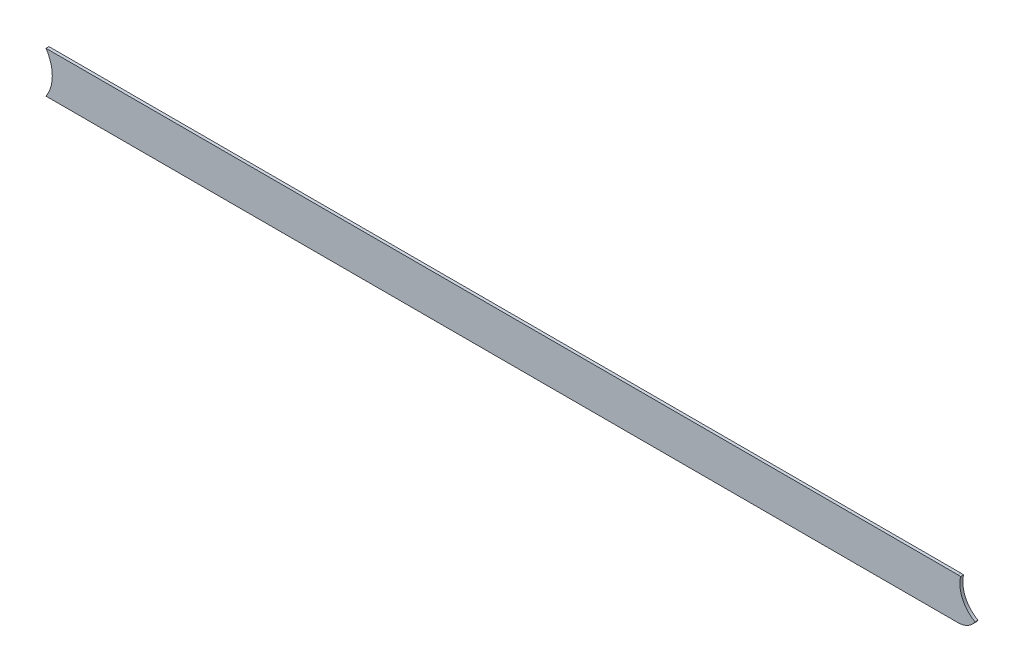
ISO-10303-21;
HEADER;
FILE_DESCRIPTION(('STEP AP214'),'2;1');
FILE_NAME('part.step','',(''),(''),'','','');
FILE_SCHEMA(('AUTOMOTIVE_DESIGN { 1 0 10303 214 1 1 1 1 }'));
ENDSEC;
DATA;
#1=APPLICATION_CONTEXT('core data for automotive mechanical design processes');
#2=APPLICATION_PROTOCOL_DEFINITION('international standard','automotive_design',2000,#1);
#3=PRODUCT_CONTEXT('',#1,'mechanical');
#4=PRODUCT('Part','Part','',(#3));
#5=PRODUCT_RELATED_PRODUCT_CATEGORY('part','',(#4));
#6=PRODUCT_DEFINITION_FORMATION('','',#4);
#7=PRODUCT_DEFINITION_CONTEXT('part definition',#1,'design');
#8=PRODUCT_DEFINITION('design','',#6,#7);
#9=PRODUCT_DEFINITION_SHAPE('','',#8);
#10=(LENGTH_UNIT() NAMED_UNIT(*) SI_UNIT(.MILLI.,.METRE.));
#11=(NAMED_UNIT(*) PLANE_ANGLE_UNIT() SI_UNIT($,.RADIAN.));
#12=(NAMED_UNIT(*) SI_UNIT($,.STERADIAN.) SOLID_ANGLE_UNIT());
#13=UNCERTAINTY_MEASURE_WITH_UNIT(LENGTH_MEASURE(1.E-05),#10,'distance_accuracy_value','');
#14=(GEOMETRIC_REPRESENTATION_CONTEXT(3) GLOBAL_UNCERTAINTY_ASSIGNED_CONTEXT((#13)) GLOBAL_UNIT_ASSIGNED_CONTEXT((#10,
#11,#12)) REPRESENTATION_CONTEXT('',''));
#15=CARTESIAN_POINT('',(0.,0.,0.));
#16=DIRECTION('',(0.,0.,1.));
#17=DIRECTION('',(1.,0.,0.));
#18=AXIS2_PLACEMENT_3D('',#15,#16,#17);
#19=CARTESIAN_POINT('',(51.0251685903459,104.0780113,0.));
#20=DIRECTION('',(0.,1.,0.));
#21=DIRECTION('',(1.,0.,0.));
#22=AXIS2_PLACEMENT_3D('',#19,#20,#21);
#23=PLANE('',#22);
#24=DIRECTION('',(1.,0.,0.));
#25=VECTOR('',#24,1.);
#26=CARTESIAN_POINT('',(50.6510036,104.0780113,0.03556));
#27=LINE('',#26,#25);
#28=CARTESIAN_POINT('',(51.0251685903459,104.0780113,0.03556));
#29=VERTEX_POINT('',#28);
#30=CARTESIAN_POINT('',(62.0196499,104.0780113,0.03556));
#31=VERTEX_POINT('',#30);
#32=EDGE_CURVE('E11',#29,#31,#27,.T.);
#33=ORIENTED_EDGE('',*,*,#32,.F.);
#34=DIRECTION('',(0.,0.,1.));
#35=VECTOR('',#34,1.);
#36=CARTESIAN_POINT('',(51.0251685903459,104.0780113,0.));
#37=LINE('',#36,#35);
#38=CARTESIAN_POINT('',(51.0251685903459,104.0780113,0.));
#39=VERTEX_POINT('',#38);
#40=EDGE_CURVE('E24',#39,#29,#37,.T.);
#41=ORIENTED_EDGE('',*,*,#40,.F.);
#42=DIRECTION('',(1.,0.,0.));
#43=VECTOR('',#42,1.);
#44=CARTESIAN_POINT('',(50.6510036,104.0780113,0.));
#45=LINE('',#44,#43);
#46=CARTESIAN_POINT('',(62.0196499,104.0780113,0.));
#47=VERTEX_POINT('',#46);
#48=EDGE_CURVE('E94',#39,#47,#45,.T.);
#49=ORIENTED_EDGE('',*,*,#48,.T.);
#50=DIRECTION('',(0.,0.,1.));
#51=VECTOR('',#50,1.);
#52=CARTESIAN_POINT('',(62.0196499,104.0780113,0.));
#53=LINE('',#52,#51);
#54=EDGE_CURVE('E37',#47,#31,#53,.T.);
#55=ORIENTED_EDGE('',*,*,#54,.T.);
#56=EDGE_LOOP('',(#33,#41,#49,#55));
#57=FACE_BOUND('',#56,.T.);
#58=ADVANCED_FACE('F17',(#57),#23,.F.);
#59=CARTESIAN_POINT('',(62.0196499,104.3280108,0.));
#60=DIRECTION('',(0.,0.,-1.));
#61=DIRECTION('',(0.,-1.,0.));
#62=AXIS2_PLACEMENT_3D('',#59,#60,#61);
#63=CYLINDRICAL_SURFACE('',#62,0.249999500000001);
#64=CARTESIAN_POINT('',(62.0196499,104.3280108,0.03556));
#65=DIRECTION('',(0.,0.,1.));
#66=DIRECTION('',(0.,-1.,0.));
#67=AXIS2_PLACEMENT_3D('',#64,#65,#66);
#68=CIRCLE('',#67,0.249999500000001);
#69=CARTESIAN_POINT('',(62.2274743838054,104.189054929554,0.03556));
#70=VERTEX_POINT('',#69);
#71=EDGE_CURVE('E123',#31,#70,#68,.T.);
#72=ORIENTED_EDGE('',*,*,#71,.F.);
#73=ORIENTED_EDGE('',*,*,#54,.F.);
#74=CARTESIAN_POINT('',(62.0196499,104.3280108,0.));
#75=DIRECTION('',(0.,0.,1.));
#76=DIRECTION('',(0.,-1.,0.));
#77=AXIS2_PLACEMENT_3D('',#74,#75,#76);
#78=CIRCLE('',#77,0.249999500000001);
#79=CARTESIAN_POINT('',(62.2274743838054,104.189054929554,0.));
#80=VERTEX_POINT('',#79);
#81=EDGE_CURVE('E120',#47,#80,#78,.T.);
#82=ORIENTED_EDGE('',*,*,#81,.T.);
#83=DIRECTION('',(0.,0.,1.));
#84=VECTOR('',#83,1.);
#85=CARTESIAN_POINT('',(62.2274743838054,104.189054929554,0.));
#86=LINE('',#85,#84);
#87=EDGE_CURVE('E118',#80,#70,#86,.T.);
#88=ORIENTED_EDGE('',*,*,#87,.T.);
#89=EDGE_LOOP('',(#72,#73,#82,#88));
#90=FACE_BOUND('',#89,.T.);
#91=ADVANCED_FACE('F131',(#90),#63,.T.);
#92=CARTESIAN_POINT('',(62.39999966,104.49999928,0.));
#93=DIRECTION('',(0.,0.,-1.));
#94=DIRECTION('',(1.,0.,0.));
#95=AXIS2_PLACEMENT_3D('',#92,#93,#94);
#96=CYLINDRICAL_SURFACE('',#95,0.3556);
#97=DIRECTION('',(0.,0.,1.));
#98=VECTOR('',#97,1.);
#99=CARTESIAN_POINT('',(62.0525795315317,104.575832085138,0.));
#100=LINE('',#99,#98);
#101=CARTESIAN_POINT('',(62.0525795315317,104.575832085138,0.));
#102=VERTEX_POINT('',#101);
#103=CARTESIAN_POINT('',(62.0525795315317,104.575832085138,0.03556));
#104=VERTEX_POINT('',#103);
#105=EDGE_CURVE('E116',#102,#104,#100,.T.);
#106=ORIENTED_EDGE('',*,*,#105,.T.);
#107=CARTESIAN_POINT('',(62.39999966,104.49999928,0.03556));
#108=DIRECTION('',(0.,0.,1.));
#109=DIRECTION('',(1.,0.,0.));
#110=AXIS2_PLACEMENT_3D('',#107,#108,#109);
#111=CIRCLE('',#110,0.3556);
#112=EDGE_CURVE('E113',#104,#70,#111,.T.);
#113=ORIENTED_EDGE('',*,*,#112,.T.);
#114=ORIENTED_EDGE('',*,*,#87,.F.);
#115=CARTESIAN_POINT('',(62.39999966,104.49999928,0.));
#116=DIRECTION('',(0.,0.,1.));
#117=DIRECTION('',(1.,0.,0.));
#118=AXIS2_PLACEMENT_3D('',#115,#116,#117);
#119=CIRCLE('',#118,0.3556);
#120=EDGE_CURVE('E110',#102,#80,#119,.T.);
#121=ORIENTED_EDGE('',*,*,#120,.F.);
#122=EDGE_LOOP('',(#106,#113,#114,#121));
#123=FACE_BOUND('',#122,.T.);
#124=ADVANCED_FACE('F137',(#123),#96,.F.);
#125=CARTESIAN_POINT('',(62.0196499,104.3280108,0.));
#126=DIRECTION('',(0.,0.,-1.));
#127=DIRECTION('',(0.,-1.,0.));
#128=AXIS2_PLACEMENT_3D('',#125,#126,#127);
#129=CYLINDRICAL_SURFACE('',#128,0.249999500000001);
#130=CARTESIAN_POINT('',(62.0196499,104.3280108,0.03556));
#131=DIRECTION('',(0.,0.,1.));
#132=DIRECTION('',(0.,-1.,0.));
#133=AXIS2_PLACEMENT_3D('',#130,#131,#132);
#134=CIRCLE('',#133,0.249999500000001);
#135=CARTESIAN_POINT('',(62.0196499,104.5780103,0.03556));
#136=VERTEX_POINT('',#135);
#137=EDGE_CURVE('E107',#104,#136,#134,.T.);
#138=ORIENTED_EDGE('',*,*,#137,.F.);
#139=ORIENTED_EDGE('',*,*,#105,.F.);
#140=CARTESIAN_POINT('',(62.0196499,104.5780103,0.));
#141=VERTEX_POINT('',#140);
#142=EDGE_CURVE('E106',#102,#141,#78,.T.);
#143=ORIENTED_EDGE('',*,*,#142,.T.);
#144=DIRECTION('',(0.,0.,1.));
#145=VECTOR('',#144,1.);
#146=CARTESIAN_POINT('',(62.0196499,104.5780103,0.));
#147=LINE('',#146,#145);
#148=EDGE_CURVE('E104',#141,#136,#147,.T.);
#149=ORIENTED_EDGE('',*,*,#148,.T.);
#150=EDGE_LOOP('',(#138,#139,#143,#149));
#151=FACE_BOUND('',#150,.T.);
#152=ADVANCED_FACE('F140',(#151),#129,.T.);
#153=CARTESIAN_POINT('',(62.0196499,104.5780103,0.));
#154=DIRECTION('',(0.,-1.,0.));
#155=DIRECTION('',(-1.,0.,0.));
#156=AXIS2_PLACEMENT_3D('',#153,#154,#155);
#157=PLANE('',#156);
#158=DIRECTION('',(-1.,0.,0.));
#159=VECTOR('',#158,1.);
#160=CARTESIAN_POINT('',(62.0196499,104.5780103,0.03556));
#161=LINE('',#160,#159);
#162=CARTESIAN_POINT('',(51.0251685903459,104.5780103,0.03556));
#163=VERTEX_POINT('',#162);
#164=EDGE_CURVE('E101',#136,#163,#161,.T.);
#165=ORIENTED_EDGE('',*,*,#164,.F.);
#166=ORIENTED_EDGE('',*,*,#148,.F.);
#167=DIRECTION('',(-1.,0.,0.));
#168=VECTOR('',#167,1.);
#169=CARTESIAN_POINT('',(62.0196499,104.5780103,0.));
#170=LINE('',#169,#168);
#171=CARTESIAN_POINT('',(51.0251685903459,104.5780103,0.));
#172=VERTEX_POINT('',#171);
#173=EDGE_CURVE('E99',#141,#172,#170,.T.);
#174=ORIENTED_EDGE('',*,*,#173,.T.);
#175=DIRECTION('',(0.,0.,1.));
#176=VECTOR('',#175,1.);
#177=CARTESIAN_POINT('',(51.0251685903459,104.5780103,0.));
#178=LINE('',#177,#176);
#179=EDGE_CURVE('E81',#172,#163,#178,.T.);
#180=ORIENTED_EDGE('',*,*,#179,.T.);
#181=EDGE_LOOP('',(#165,#166,#174,#180));
#182=FACE_BOUND('',#181,.T.);
#183=ADVANCED_FACE('F143',(#182),#157,.F.);
#184=CARTESIAN_POINT('',(50.6510036,104.3280108,0.));
#185=DIRECTION('',(0.,0.,-1.));
#186=DIRECTION('',(1.,0.,0.));
#187=AXIS2_PLACEMENT_3D('',#184,#185,#186);
#188=CYLINDRICAL_SURFACE('',#187,0.4499991);
#189=DIRECTION('',(0.,0.,1.));
#190=VECTOR('',#189,1.);
#191=CARTESIAN_POINT('',(51.1010027,104.3280108,0.));
#192=LINE('',#191,#190);
#193=CARTESIAN_POINT('',(51.1010027,104.3280108,0.));
#194=VERTEX_POINT('',#193);
#195=CARTESIAN_POINT('',(51.1010027,104.3280108,0.03556));
#196=VERTEX_POINT('',#195);
#197=EDGE_CURVE('E71',#194,#196,#192,.T.);
#198=ORIENTED_EDGE('',*,*,#197,.T.);
#199=CARTESIAN_POINT('',(50.6510036,104.3280108,0.03556));
#200=DIRECTION('',(0.,0.,1.));
#201=DIRECTION('',(1.,0.,0.));
#202=AXIS2_PLACEMENT_3D('',#199,#200,#201);
#203=CIRCLE('',#202,0.4499991);
#204=EDGE_CURVE('E82',#196,#163,#203,.T.);
#205=ORIENTED_EDGE('',*,*,#204,.T.);
#206=ORIENTED_EDGE('',*,*,#179,.F.);
#207=CARTESIAN_POINT('',(50.6510036,104.3280108,0.));
#208=DIRECTION('',(0.,0.,1.));
#209=DIRECTION('',(1.,0.,0.));
#210=AXIS2_PLACEMENT_3D('',#207,#208,#209);
#211=CIRCLE('',#210,0.4499991);
#212=EDGE_CURVE('E85',#194,#172,#211,.T.);
#213=ORIENTED_EDGE('',*,*,#212,.F.);
#214=EDGE_LOOP('',(#198,#205,#206,#213));
#215=FACE_BOUND('',#214,.T.);
#216=ADVANCED_FACE('F86',(#215),#188,.F.);
#217=CARTESIAN_POINT('',(50.6510036,104.3280108,0.));
#218=DIRECTION('',(0.,0.,-1.));
#219=DIRECTION('',(1.,0.,0.));
#220=AXIS2_PLACEMENT_3D('',#217,#218,#219);
#221=CYLINDRICAL_SURFACE('',#220,0.4499991);
#222=ORIENTED_EDGE('',*,*,#40,.T.);
#223=CARTESIAN_POINT('',(50.6510036,104.3280108,0.03556));
#224=DIRECTION('',(0.,0.,1.));
#225=DIRECTION('',(1.,0.,0.));
#226=AXIS2_PLACEMENT_3D('',#223,#224,#225);
#227=CIRCLE('',#226,0.4499991);
#228=EDGE_CURVE('E77',#29,#196,#227,.T.);
#229=ORIENTED_EDGE('',*,*,#228,.T.);
#230=ORIENTED_EDGE('',*,*,#197,.F.);
#231=EDGE_CURVE('E75',#39,#194,#211,.T.);
#232=ORIENTED_EDGE('',*,*,#231,.F.);
#233=EDGE_LOOP('',(#222,#229,#230,#232));
#234=FACE_BOUND('',#233,.T.);
#235=ADVANCED_FACE('F73',(#234),#221,.F.);
#236=CARTESIAN_POINT('',(50.6510036,104.0780113,0.));
#237=DIRECTION('',(0.,0.,-1.));
#238=DIRECTION('',(-1.,0.,0.));
#239=AXIS2_PLACEMENT_3D('',#236,#237,#238);
#240=PLANE('',#239);
#241=ORIENTED_EDGE('',*,*,#48,.F.);
#242=ORIENTED_EDGE('',*,*,#231,.T.);
#243=ORIENTED_EDGE('',*,*,#212,.T.);
#244=ORIENTED_EDGE('',*,*,#173,.F.);
#245=ORIENTED_EDGE('',*,*,#142,.F.);
#246=ORIENTED_EDGE('',*,*,#120,.T.);
#247=ORIENTED_EDGE('',*,*,#81,.F.);
#248=EDGE_LOOP('',(#241,#242,#243,#244,#245,#246,#247));
#249=FACE_BOUND('',#248,.T.);
#250=ADVANCED_FACE('F92',(#249),#240,.T.);
#251=CARTESIAN_POINT('',(50.6510036,104.0780113,0.03556));
#252=DIRECTION('',(0.,0.,-1.));
#253=DIRECTION('',(-1.,0.,0.));
#254=AXIS2_PLACEMENT_3D('',#251,#252,#253);
#255=PLANE('',#254);
#256=ORIENTED_EDGE('',*,*,#228,.F.);
#257=ORIENTED_EDGE('',*,*,#32,.T.);
#258=ORIENTED_EDGE('',*,*,#71,.T.);
#259=ORIENTED_EDGE('',*,*,#112,.F.);
#260=ORIENTED_EDGE('',*,*,#137,.T.);
#261=ORIENTED_EDGE('',*,*,#164,.T.);
#262=ORIENTED_EDGE('',*,*,#204,.F.);
#263=EDGE_LOOP('',(#256,#257,#258,#259,#260,#261,#262));
#264=FACE_BOUND('',#263,.T.);
#265=ADVANCED_FACE('F134',(#264),#255,.F.);
#266=CLOSED_SHELL('',(#58,#91,#124,#152,#183,#216,#235,#250,#265));
#267=MANIFOLD_SOLID_BREP('B1',#266);
#268=ADVANCED_BREP_SHAPE_REPRESENTATION('',(#18,#267),#14);
#269=SHAPE_DEFINITION_REPRESENTATION(#9,#268);
ENDSEC;
END-ISO-10303-21;
